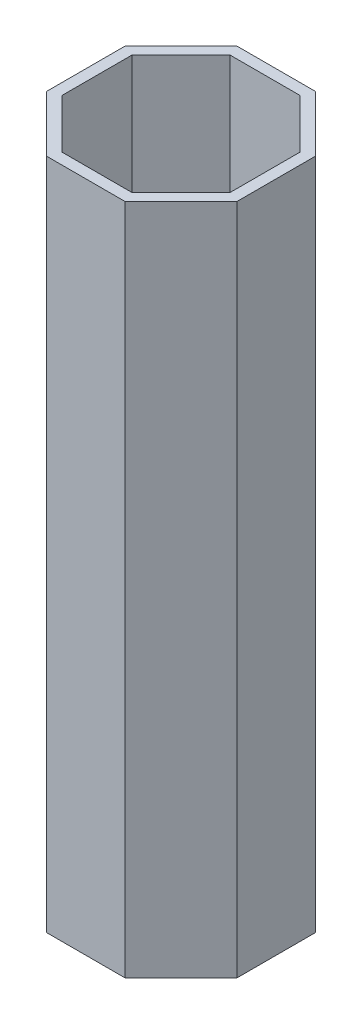
ISO-10303-21;
HEADER;
FILE_DESCRIPTION(('STEP AP214'),'2;1');
FILE_NAME('part.step','',(''),(''),'','','');
FILE_SCHEMA(('AUTOMOTIVE_DESIGN { 1 0 10303 214 1 1 1 1 }'));
ENDSEC;
DATA;
#1=APPLICATION_CONTEXT('core data for automotive mechanical design processes');
#2=APPLICATION_PROTOCOL_DEFINITION('international standard','automotive_design',2000,#1);
#3=PRODUCT_CONTEXT('',#1,'mechanical');
#4=PRODUCT('Part','Part','',(#3));
#5=PRODUCT_RELATED_PRODUCT_CATEGORY('part','',(#4));
#6=PRODUCT_DEFINITION_FORMATION('','',#4);
#7=PRODUCT_DEFINITION_CONTEXT('part definition',#1,'design');
#8=PRODUCT_DEFINITION('design','',#6,#7);
#9=PRODUCT_DEFINITION_SHAPE('','',#8);
#10=(LENGTH_UNIT() NAMED_UNIT(*) SI_UNIT(.MILLI.,.METRE.));
#11=(NAMED_UNIT(*) PLANE_ANGLE_UNIT() SI_UNIT($,.RADIAN.));
#12=(NAMED_UNIT(*) SI_UNIT($,.STERADIAN.) SOLID_ANGLE_UNIT());
#13=UNCERTAINTY_MEASURE_WITH_UNIT(LENGTH_MEASURE(1.E-05),#10,'distance_accuracy_value','');
#14=(GEOMETRIC_REPRESENTATION_CONTEXT(3) GLOBAL_UNCERTAINTY_ASSIGNED_CONTEXT((#13)) GLOBAL_UNIT_ASSIGNED_CONTEXT((#10,
#11,#12)) REPRESENTATION_CONTEXT('',''));
#15=CARTESIAN_POINT('',(0.,0.,0.));
#16=DIRECTION('',(0.,0.,1.));
#17=DIRECTION('',(1.,0.,0.));
#18=AXIS2_PLACEMENT_3D('',#15,#16,#17);
#19=CARTESIAN_POINT('',(0.,120.,-11.));
#20=DIRECTION('',(0.,-1.,0.));
#21=DIRECTION('',(0.,0.,-1.));
#22=AXIS2_PLACEMENT_3D('',#19,#20,#21);
#23=CYLINDRICAL_SURFACE('',#22,1.55);
#24=CARTESIAN_POINT('',(0.,0.,-11.));
#25=DIRECTION('',(0.,1.,0.));
#26=DIRECTION('',(0.,0.,1.));
#27=AXIS2_PLACEMENT_3D('',#24,#25,#26);
#28=CIRCLE('',#27,1.55);
#29=CARTESIAN_POINT('',(0.,0.,-9.45));
#30=VERTEX_POINT('',#29);
#31=EDGE_CURVE('E155',#30,#30,#28,.T.);
#32=ORIENTED_EDGE('',*,*,#31,.F.);
#33=EDGE_LOOP('',(#32));
#34=FACE_BOUND('',#33,.T.);
#35=CARTESIAN_POINT('',(0.,3.,-11.));
#36=DIRECTION('',(0.,1.,0.));
#37=DIRECTION('',(0.,0.,1.));
#38=AXIS2_PLACEMENT_3D('',#35,#36,#37);
#39=CIRCLE('',#38,1.55);
#40=CARTESIAN_POINT('',(0.,3.,-9.45));
#41=VERTEX_POINT('',#40);
#42=EDGE_CURVE('E231',#41,#41,#39,.T.);
#43=ORIENTED_EDGE('',*,*,#42,.T.);
#44=EDGE_LOOP('',(#43));
#45=FACE_BOUND('',#44,.T.);
#46=ADVANCED_FACE('F41',(#34,#45),#23,.F.);
#47=CARTESIAN_POINT('',(0.,120.,0.));
#48=DIRECTION('',(0.,-1.,0.));
#49=DIRECTION('',(0.,0.,-1.));
#50=AXIS2_PLACEMENT_3D('',#47,#48,#49);
#51=CYLINDRICAL_SURFACE('',#50,4.);
#52=CARTESIAN_POINT('',(0.,0.,0.));
#53=DIRECTION('',(0.,1.,0.));
#54=DIRECTION('',(0.,0.,1.));
#55=AXIS2_PLACEMENT_3D('',#52,#53,#54);
#56=CIRCLE('',#55,4.);
#57=CARTESIAN_POINT('',(0.,0.,4.));
#58=VERTEX_POINT('',#57);
#59=EDGE_CURVE('E207',#58,#58,#56,.T.);
#60=ORIENTED_EDGE('',*,*,#59,.F.);
#61=EDGE_LOOP('',(#60));
#62=FACE_BOUND('',#61,.T.);
#63=CARTESIAN_POINT('',(0.,3.,0.));
#64=DIRECTION('',(0.,1.,0.));
#65=DIRECTION('',(0.,0.,1.));
#66=AXIS2_PLACEMENT_3D('',#63,#64,#65);
#67=CIRCLE('',#66,4.);
#68=CARTESIAN_POINT('',(0.,3.,4.));
#69=VERTEX_POINT('',#68);
#70=EDGE_CURVE('E234',#69,#69,#67,.T.);
#71=ORIENTED_EDGE('',*,*,#70,.T.);
#72=EDGE_LOOP('',(#71));
#73=FACE_BOUND('',#72,.T.);
#74=ADVANCED_FACE('F406',(#62,#73),#51,.F.);
#75=CARTESIAN_POINT('',(7.7781745930523,120.,-7.77817459305268));
#76=DIRECTION('',(0.,-1.,0.));
#77=DIRECTION('',(0.,0.,-1.));
#78=AXIS2_PLACEMENT_3D('',#75,#76,#77);
#79=CYLINDRICAL_SURFACE('',#78,1.55000000000008);
#80=CARTESIAN_POINT('',(7.7781745930523,0.,-7.77817459305268));
#81=DIRECTION('',(0.,1.,0.));
#82=DIRECTION('',(0.,0.,1.));
#83=AXIS2_PLACEMENT_3D('',#80,#81,#82);
#84=CIRCLE('',#83,1.55000000000008);
#85=CARTESIAN_POINT('',(7.7781745930523,0.,-6.2281745930526));
#86=VERTEX_POINT('',#85);
#87=EDGE_CURVE('E210',#86,#86,#84,.T.);
#88=ORIENTED_EDGE('',*,*,#87,.F.);
#89=EDGE_LOOP('',(#88));
#90=FACE_BOUND('',#89,.T.);
#91=CARTESIAN_POINT('',(7.7781745930523,3.,-7.77817459305268));
#92=DIRECTION('',(0.,1.,0.));
#93=DIRECTION('',(0.,0.,1.));
#94=AXIS2_PLACEMENT_3D('',#91,#92,#93);
#95=CIRCLE('',#94,1.55000000000008);
#96=CARTESIAN_POINT('',(7.7781745930523,3.,-6.2281745930526));
#97=VERTEX_POINT('',#96);
#98=EDGE_CURVE('E237',#97,#97,#95,.T.);
#99=ORIENTED_EDGE('',*,*,#98,.T.);
#100=EDGE_LOOP('',(#99));
#101=FACE_BOUND('',#100,.T.);
#102=ADVANCED_FACE('F412',(#90,#101),#79,.F.);
#103=CARTESIAN_POINT('',(11.0000000000009,120.,-9.3656929972427E-13));
#104=DIRECTION('',(0.,-1.,0.));
#105=DIRECTION('',(0.,0.,-1.));
#106=AXIS2_PLACEMENT_3D('',#103,#104,#105);
#107=CYLINDRICAL_SURFACE('',#106,1.55000000000066);
#108=CARTESIAN_POINT('',(11.0000000000009,0.,-9.3656929972427E-13));
#109=DIRECTION('',(0.,1.,0.));
#110=DIRECTION('',(0.,0.,1.));
#111=AXIS2_PLACEMENT_3D('',#108,#109,#110);
#112=CIRCLE('',#111,1.55000000000066);
#113=CARTESIAN_POINT('',(11.0000000000009,0.,1.54999999999972));
#114=VERTEX_POINT('',#113);
#115=EDGE_CURVE('E213',#114,#114,#112,.T.);
#116=ORIENTED_EDGE('',*,*,#115,.F.);
#117=EDGE_LOOP('',(#116));
#118=FACE_BOUND('',#117,.T.);
#119=CARTESIAN_POINT('',(11.0000000000009,3.,-9.3656929972427E-13));
#120=DIRECTION('',(0.,1.,0.));
#121=DIRECTION('',(0.,0.,1.));
#122=AXIS2_PLACEMENT_3D('',#119,#120,#121);
#123=CIRCLE('',#122,1.55000000000066);
#124=CARTESIAN_POINT('',(11.0000000000009,3.,1.54999999999972));
#125=VERTEX_POINT('',#124);
#126=EDGE_CURVE('E240',#125,#125,#123,.T.);
#127=ORIENTED_EDGE('',*,*,#126,.T.);
#128=EDGE_LOOP('',(#127));
#129=FACE_BOUND('',#128,.T.);
#130=ADVANCED_FACE('F491',(#118,#129),#107,.F.);
#131=CARTESIAN_POINT('',(7.77817459305362,120.,7.77817459305136));
#132=DIRECTION('',(0.,-1.,0.));
#133=DIRECTION('',(0.,0.,-1.));
#134=AXIS2_PLACEMENT_3D('',#131,#132,#133);
#135=CYLINDRICAL_SURFACE('',#134,1.55000000000139);
#136=CARTESIAN_POINT('',(7.77817459305362,0.,7.77817459305136));
#137=DIRECTION('',(0.,1.,0.));
#138=DIRECTION('',(0.,0.,1.));
#139=AXIS2_PLACEMENT_3D('',#136,#137,#138);
#140=CIRCLE('',#139,1.55000000000139);
#141=CARTESIAN_POINT('',(7.77817459305362,0.,9.32817459305275));
#142=VERTEX_POINT('',#141);
#143=EDGE_CURVE('E216',#142,#142,#140,.T.);
#144=ORIENTED_EDGE('',*,*,#143,.F.);
#145=EDGE_LOOP('',(#144));
#146=FACE_BOUND('',#145,.T.);
#147=CARTESIAN_POINT('',(7.77817459305362,3.,7.77817459305136));
#148=DIRECTION('',(0.,1.,0.));
#149=DIRECTION('',(0.,0.,1.));
#150=AXIS2_PLACEMENT_3D('',#147,#148,#149);
#151=CIRCLE('',#150,1.55000000000139);
#152=CARTESIAN_POINT('',(7.77817459305362,3.,9.32817459305275));
#153=VERTEX_POINT('',#152);
#154=EDGE_CURVE('E243',#153,#153,#151,.T.);
#155=ORIENTED_EDGE('',*,*,#154,.T.);
#156=EDGE_LOOP('',(#155));
#157=FACE_BOUND('',#156,.T.);
#158=ADVANCED_FACE('F483',(#146,#157),#135,.F.);
#159=CARTESIAN_POINT('',(1.87313859944854E-12,120.,11.));
#160=DIRECTION('',(0.,-1.,0.));
#161=DIRECTION('',(0.,0.,-1.));
#162=AXIS2_PLACEMENT_3D('',#159,#160,#161);
#163=CYLINDRICAL_SURFACE('',#162,1.55000000000186);
#164=CARTESIAN_POINT('',(1.87313859944854E-12,0.,11.));
#165=DIRECTION('',(0.,1.,0.));
#166=DIRECTION('',(0.,0.,1.));
#167=AXIS2_PLACEMENT_3D('',#164,#165,#166);
#168=CIRCLE('',#167,1.55000000000186);
#169=CARTESIAN_POINT('',(1.87313859944854E-12,0.,12.5500000000019));
#170=VERTEX_POINT('',#169);
#171=EDGE_CURVE('E219',#170,#170,#168,.T.);
#172=ORIENTED_EDGE('',*,*,#171,.F.);
#173=EDGE_LOOP('',(#172));
#174=FACE_BOUND('',#173,.T.);
#175=CARTESIAN_POINT('',(1.87313859944854E-12,3.,11.));
#176=DIRECTION('',(0.,1.,0.));
#177=DIRECTION('',(0.,0.,1.));
#178=AXIS2_PLACEMENT_3D('',#175,#176,#177);
#179=CIRCLE('',#178,1.55000000000186);
#180=CARTESIAN_POINT('',(1.87313859944854E-12,3.,12.5500000000019));
#181=VERTEX_POINT('',#180);
#182=EDGE_CURVE('E246',#181,#181,#179,.T.);
#183=ORIENTED_EDGE('',*,*,#182,.T.);
#184=EDGE_LOOP('',(#183));
#185=FACE_BOUND('',#184,.T.);
#186=ADVANCED_FACE('F475',(#174,#185),#163,.F.);
#187=CARTESIAN_POINT('',(-7.77817459305042,120.,7.77817459305269));
#188=DIRECTION('',(0.,-1.,0.));
#189=DIRECTION('',(0.,0.,-1.));
#190=AXIS2_PLACEMENT_3D('',#187,#188,#189);
#191=CYLINDRICAL_SURFACE('',#190,1.55000000000181);
#192=CARTESIAN_POINT('',(-7.77817459305042,0.,7.77817459305269));
#193=DIRECTION('',(0.,1.,0.));
#194=DIRECTION('',(0.,0.,1.));
#195=AXIS2_PLACEMENT_3D('',#192,#193,#194);
#196=CIRCLE('',#195,1.55000000000181);
#197=CARTESIAN_POINT('',(-7.77817459305042,0.,9.3281745930545));
#198=VERTEX_POINT('',#197);
#199=EDGE_CURVE('E222',#198,#198,#196,.T.);
#200=ORIENTED_EDGE('',*,*,#199,.F.);
#201=EDGE_LOOP('',(#200));
#202=FACE_BOUND('',#201,.T.);
#203=CARTESIAN_POINT('',(-7.77817459305042,3.,7.77817459305269));
#204=DIRECTION('',(0.,1.,0.));
#205=DIRECTION('',(0.,0.,1.));
#206=AXIS2_PLACEMENT_3D('',#203,#204,#205);
#207=CIRCLE('',#206,1.55000000000181);
#208=CARTESIAN_POINT('',(-7.77817459305042,3.,9.3281745930545));
#209=VERTEX_POINT('',#208);
#210=EDGE_CURVE('E249',#209,#209,#207,.T.);
#211=ORIENTED_EDGE('',*,*,#210,.T.);
#212=EDGE_LOOP('',(#211));
#213=FACE_BOUND('',#212,.T.);
#214=ADVANCED_FACE('F467',(#202,#213),#191,.F.);
#215=CARTESIAN_POINT('',(-10.9999999999991,120.,9.37916411203332E-13));
#216=DIRECTION('',(0.,-1.,0.));
#217=DIRECTION('',(0.,0.,-1.));
#218=AXIS2_PLACEMENT_3D('',#215,#216,#217);
#219=CYLINDRICAL_SURFACE('',#218,1.55000000000128);
#220=CARTESIAN_POINT('',(-10.9999999999991,0.,9.37916411203332E-13));
#221=DIRECTION('',(0.,1.,0.));
#222=DIRECTION('',(0.,0.,1.));
#223=AXIS2_PLACEMENT_3D('',#220,#221,#222);
#224=CIRCLE('',#223,1.55000000000128);
#225=CARTESIAN_POINT('',(-10.9999999999991,0.,1.55000000000222));
#226=VERTEX_POINT('',#225);
#227=EDGE_CURVE('E225',#226,#226,#224,.T.);
#228=ORIENTED_EDGE('',*,*,#227,.F.);
#229=EDGE_LOOP('',(#228));
#230=FACE_BOUND('',#229,.T.);
#231=CARTESIAN_POINT('',(-10.9999999999991,3.,9.37916411203332E-13));
#232=DIRECTION('',(0.,1.,0.));
#233=DIRECTION('',(0.,0.,1.));
#234=AXIS2_PLACEMENT_3D('',#231,#232,#233);
#235=CIRCLE('',#234,1.55000000000128);
#236=CARTESIAN_POINT('',(-10.9999999999991,3.,1.55000000000222));
#237=VERTEX_POINT('',#236);
#238=EDGE_CURVE('E252',#237,#237,#235,.T.);
#239=ORIENTED_EDGE('',*,*,#238,.T.);
#240=EDGE_LOOP('',(#239));
#241=FACE_BOUND('',#240,.T.);
#242=ADVANCED_FACE('F459',(#230,#241),#219,.F.);
#243=CARTESIAN_POINT('',(-7.77817459305175,120.,-7.77817459305136));
#244=DIRECTION('',(0.,-1.,0.));
#245=DIRECTION('',(0.,0.,-1.));
#246=AXIS2_PLACEMENT_3D('',#243,#244,#245);
#247=CYLINDRICAL_SURFACE('',#246,1.55000000000058);
#248=CARTESIAN_POINT('',(-7.77817459305175,0.,-7.77817459305136));
#249=DIRECTION('',(0.,1.,0.));
#250=DIRECTION('',(0.,0.,1.));
#251=AXIS2_PLACEMENT_3D('',#248,#249,#250);
#252=CIRCLE('',#251,1.55000000000058);
#253=CARTESIAN_POINT('',(-7.77817459305175,0.,-6.22817459305077));
#254=VERTEX_POINT('',#253);
#255=EDGE_CURVE('E228',#254,#254,#252,.T.);
#256=ORIENTED_EDGE('',*,*,#255,.F.);
#257=EDGE_LOOP('',(#256));
#258=FACE_BOUND('',#257,.T.);
#259=CARTESIAN_POINT('',(-7.77817459305175,3.,-7.77817459305136));
#260=DIRECTION('',(0.,1.,0.));
#261=DIRECTION('',(0.,0.,1.));
#262=AXIS2_PLACEMENT_3D('',#259,#260,#261);
#263=CIRCLE('',#262,1.55000000000058);
#264=CARTESIAN_POINT('',(-7.77817459305175,3.,-6.22817459305077));
#265=VERTEX_POINT('',#264);
#266=EDGE_CURVE('E45',#265,#265,#263,.T.);
#267=ORIENTED_EDGE('',*,*,#266,.T.);
#268=EDGE_LOOP('',(#267));
#269=FACE_BOUND('',#268,.T.);
#270=ADVANCED_FACE('F421',(#258,#269),#247,.F.);
#271=CARTESIAN_POINT('',(0.,120.,0.));
#272=DIRECTION('',(0.,1.,0.));
#273=DIRECTION('',(0.,0.,1.));
#274=AXIS2_PLACEMENT_3D('',#271,#272,#273);
#275=PLANE('',#274);
#276=DIRECTION('',(-0.707106781186548,0.,-0.707106781186547));
#277=VECTOR('',#276,1.);
#278=CARTESIAN_POINT('',(15.,120.,-6.21320343559643));
#279=LINE('',#278,#277);
#280=CARTESIAN_POINT('',(15.,120.,-6.21320343559643));
#281=VERTEX_POINT('',#280);
#282=CARTESIAN_POINT('',(6.21320343559643,120.,-15.));
#283=VERTEX_POINT('',#282);
#284=EDGE_CURVE('E58',#281,#283,#279,.T.);
#285=ORIENTED_EDGE('',*,*,#284,.F.);
#286=DIRECTION('',(0.,0.,-1.));
#287=VECTOR('',#286,1.);
#288=CARTESIAN_POINT('',(15.,120.,6.21320343559643));
#289=LINE('',#288,#287);
#290=CARTESIAN_POINT('',(15.,120.,6.21320343559643));
#291=VERTEX_POINT('',#290);
#292=EDGE_CURVE('E262',#291,#281,#289,.T.);
#293=ORIENTED_EDGE('',*,*,#292,.F.);
#294=DIRECTION('',(0.707106781186547,0.,-0.707106781186548));
#295=VECTOR('',#294,1.);
#296=CARTESIAN_POINT('',(6.21320343559643,120.,15.));
#297=LINE('',#296,#295);
#298=CARTESIAN_POINT('',(6.21320343559643,120.,15.));
#299=VERTEX_POINT('',#298);
#300=EDGE_CURVE('E288',#299,#291,#297,.T.);
#301=ORIENTED_EDGE('',*,*,#300,.F.);
#302=DIRECTION('',(1.,0.,0.));
#303=VECTOR('',#302,1.);
#304=CARTESIAN_POINT('',(-6.21320343559642,120.,15.));
#305=LINE('',#304,#303);
#306=CARTESIAN_POINT('',(-6.21320343559642,120.,15.));
#307=VERTEX_POINT('',#306);
#308=EDGE_CURVE('E291',#307,#299,#305,.T.);
#309=ORIENTED_EDGE('',*,*,#308,.F.);
#310=DIRECTION('',(0.707106781186548,0.,0.707106781186547));
#311=VECTOR('',#310,1.);
#312=CARTESIAN_POINT('',(-15.,120.,6.21320343559643));
#313=LINE('',#312,#311);
#314=CARTESIAN_POINT('',(-15.,120.,6.21320343559643));
#315=VERTEX_POINT('',#314);
#316=EDGE_CURVE('E294',#315,#307,#313,.T.);
#317=ORIENTED_EDGE('',*,*,#316,.F.);
#318=DIRECTION('',(0.,0.,1.));
#319=VECTOR('',#318,1.);
#320=CARTESIAN_POINT('',(-15.,120.,-6.21320343559643));
#321=LINE('',#320,#319);
#322=CARTESIAN_POINT('',(-15.,120.,-6.21320343559643));
#323=VERTEX_POINT('',#322);
#324=EDGE_CURVE('E297',#323,#315,#321,.T.);
#325=ORIENTED_EDGE('',*,*,#324,.F.);
#326=DIRECTION('',(-0.707106781186547,0.,0.707106781186548));
#327=VECTOR('',#326,1.);
#328=CARTESIAN_POINT('',(-6.21320343559643,120.,-15.));
#329=LINE('',#328,#327);
#330=CARTESIAN_POINT('',(-6.21320343559643,120.,-15.));
#331=VERTEX_POINT('',#330);
#332=EDGE_CURVE('E301',#331,#323,#329,.T.);
#333=ORIENTED_EDGE('',*,*,#332,.F.);
#334=DIRECTION('',(-1.,0.,0.));
#335=VECTOR('',#334,1.);
#336=CARTESIAN_POINT('',(6.21320343559643,120.,-15.));
#337=LINE('',#336,#335);
#338=EDGE_CURVE('E305',#283,#331,#337,.T.);
#339=ORIENTED_EDGE('',*,*,#338,.F.);
#340=EDGE_LOOP('',(#285,#293,#301,#309,#317,#325,#333,#339));
#341=FACE_BOUND('',#340,.T.);
#342=DIRECTION('',(0.707106781186547,0.,-0.707106781186548));
#343=VECTOR('',#342,1.);
#344=CARTESIAN_POINT('',(7.04163056034262,120.,17.));
#345=LINE('',#344,#343);
#346=CARTESIAN_POINT('',(7.04163056034262,120.,17.));
#347=VERTEX_POINT('',#346);
#348=CARTESIAN_POINT('',(17.,120.,7.04163056034261));
#349=VERTEX_POINT('',#348);
#350=EDGE_CURVE('E167',#347,#349,#345,.T.);
#351=ORIENTED_EDGE('',*,*,#350,.T.);
#352=DIRECTION('',(0.,0.,-1.));
#353=VECTOR('',#352,1.);
#354=CARTESIAN_POINT('',(17.,120.,7.04163056034261));
#355=LINE('',#354,#353);
#356=CARTESIAN_POINT('',(17.,120.,-7.04163056034262));
#357=VERTEX_POINT('',#356);
#358=EDGE_CURVE('E108',#349,#357,#355,.T.);
#359=ORIENTED_EDGE('',*,*,#358,.T.);
#360=DIRECTION('',(-0.707106781186548,0.,-0.707106781186547));
#361=VECTOR('',#360,1.);
#362=CARTESIAN_POINT('',(17.,120.,-7.04163056034262));
#363=LINE('',#362,#361);
#364=CARTESIAN_POINT('',(7.0416305603426,120.,-17.));
#365=VERTEX_POINT('',#364);
#366=EDGE_CURVE('E184',#357,#365,#363,.T.);
#367=ORIENTED_EDGE('',*,*,#366,.T.);
#368=DIRECTION('',(-1.,0.,0.));
#369=VECTOR('',#368,1.);
#370=CARTESIAN_POINT('',(7.0416305603426,120.,-17.));
#371=LINE('',#370,#369);
#372=CARTESIAN_POINT('',(-7.04163056034262,120.,-17.));
#373=VERTEX_POINT('',#372);
#374=EDGE_CURVE('E198',#365,#373,#371,.T.);
#375=ORIENTED_EDGE('',*,*,#374,.T.);
#376=DIRECTION('',(-0.707106781186547,0.,0.707106781186548));
#377=VECTOR('',#376,1.);
#378=CARTESIAN_POINT('',(-7.04163056034262,120.,-17.));
#379=LINE('',#378,#377);
#380=CARTESIAN_POINT('',(-17.,120.,-7.04163056034261));
#381=VERTEX_POINT('',#380);
#382=EDGE_CURVE('E130',#373,#381,#379,.T.);
#383=ORIENTED_EDGE('',*,*,#382,.T.);
#384=DIRECTION('',(0.,0.,1.));
#385=VECTOR('',#384,1.);
#386=CARTESIAN_POINT('',(-17.,120.,-7.04163056034261));
#387=LINE('',#386,#385);
#388=CARTESIAN_POINT('',(-17.,120.,7.04163056034262));
#389=VERTEX_POINT('',#388);
#390=EDGE_CURVE('E123',#381,#389,#387,.T.);
#391=ORIENTED_EDGE('',*,*,#390,.T.);
#392=DIRECTION('',(0.707106781186548,0.,0.707106781186547));
#393=VECTOR('',#392,1.);
#394=CARTESIAN_POINT('',(-17.,120.,7.04163056034262));
#395=LINE('',#394,#393);
#396=CARTESIAN_POINT('',(-7.04163056034261,120.,17.));
#397=VERTEX_POINT('',#396);
#398=EDGE_CURVE('E127',#389,#397,#395,.T.);
#399=ORIENTED_EDGE('',*,*,#398,.T.);
#400=DIRECTION('',(1.,0.,0.));
#401=VECTOR('',#400,1.);
#402=CARTESIAN_POINT('',(-7.04163056034261,120.,17.));
#403=LINE('',#402,#401);
#404=EDGE_CURVE('E67',#397,#347,#403,.T.);
#405=ORIENTED_EDGE('',*,*,#404,.T.);
#406=EDGE_LOOP('',(#351,#359,#367,#375,#383,#391,#399,#405));
#407=FACE_BOUND('',#406,.T.);
#408=ADVANCED_FACE('F125',(#341,#407),#275,.T.);
#409=CARTESIAN_POINT('',(0.,0.,0.));
#410=DIRECTION('',(0.,1.,0.));
#411=DIRECTION('',(0.,0.,1.));
#412=AXIS2_PLACEMENT_3D('',#409,#410,#411);
#413=PLANE('',#412);
#414=DIRECTION('',(0.707106781186547,0.,-0.707106781186548));
#415=VECTOR('',#414,1.);
#416=CARTESIAN_POINT('',(7.04163056034262,0.,17.));
#417=LINE('',#416,#415);
#418=CARTESIAN_POINT('',(7.04163056034262,0.,17.));
#419=VERTEX_POINT('',#418);
#420=CARTESIAN_POINT('',(17.,0.,7.04163056034261));
#421=VERTEX_POINT('',#420);
#422=EDGE_CURVE('E151',#419,#421,#417,.T.);
#423=ORIENTED_EDGE('',*,*,#422,.F.);
#424=DIRECTION('',(1.,0.,0.));
#425=VECTOR('',#424,1.);
#426=CARTESIAN_POINT('',(-7.04163056034261,0.,17.));
#427=LINE('',#426,#425);
#428=CARTESIAN_POINT('',(-7.04163056034261,0.,17.));
#429=VERTEX_POINT('',#428);
#430=EDGE_CURVE('E100',#429,#419,#427,.T.);
#431=ORIENTED_EDGE('',*,*,#430,.F.);
#432=DIRECTION('',(0.707106781186548,0.,0.707106781186547));
#433=VECTOR('',#432,1.);
#434=CARTESIAN_POINT('',(-17.,0.,7.04163056034262));
#435=LINE('',#434,#433);
#436=CARTESIAN_POINT('',(-17.,0.,7.04163056034262));
#437=VERTEX_POINT('',#436);
#438=EDGE_CURVE('E164',#437,#429,#435,.T.);
#439=ORIENTED_EDGE('',*,*,#438,.F.);
#440=DIRECTION('',(0.,0.,1.));
#441=VECTOR('',#440,1.);
#442=CARTESIAN_POINT('',(-17.,0.,-7.04163056034261));
#443=LINE('',#442,#441);
#444=CARTESIAN_POINT('',(-17.,0.,-7.04163056034261));
#445=VERTEX_POINT('',#444);
#446=EDGE_CURVE('E139',#445,#437,#443,.T.);
#447=ORIENTED_EDGE('',*,*,#446,.F.);
#448=DIRECTION('',(-0.707106781186547,0.,0.707106781186548));
#449=VECTOR('',#448,1.);
#450=CARTESIAN_POINT('',(-7.04163056034262,0.,-17.));
#451=LINE('',#450,#449);
#452=CARTESIAN_POINT('',(-7.04163056034262,0.,-17.));
#453=VERTEX_POINT('',#452);
#454=EDGE_CURVE('E161',#453,#445,#451,.T.);
#455=ORIENTED_EDGE('',*,*,#454,.F.);
#456=DIRECTION('',(-1.,0.,0.));
#457=VECTOR('',#456,1.);
#458=CARTESIAN_POINT('',(7.0416305603426,0.,-17.));
#459=LINE('',#458,#457);
#460=CARTESIAN_POINT('',(7.0416305603426,0.,-17.));
#461=VERTEX_POINT('',#460);
#462=EDGE_CURVE('E159',#461,#453,#459,.T.);
#463=ORIENTED_EDGE('',*,*,#462,.F.);
#464=DIRECTION('',(-0.707106781186548,0.,-0.707106781186547));
#465=VECTOR('',#464,1.);
#466=CARTESIAN_POINT('',(17.,0.,-7.04163056034262));
#467=LINE('',#466,#465);
#468=CARTESIAN_POINT('',(17.,0.,-7.04163056034262));
#469=VERTEX_POINT('',#468);
#470=EDGE_CURVE('E157',#469,#461,#467,.T.);
#471=ORIENTED_EDGE('',*,*,#470,.F.);
#472=DIRECTION('',(0.,0.,-1.));
#473=VECTOR('',#472,1.);
#474=CARTESIAN_POINT('',(17.,0.,7.04163056034261));
#475=LINE('',#474,#473);
#476=EDGE_CURVE('E154',#421,#469,#475,.T.);
#477=ORIENTED_EDGE('',*,*,#476,.F.);
#478=EDGE_LOOP('',(#423,#431,#439,#447,#455,#463,#471,#477));
#479=FACE_BOUND('',#478,.T.);
#480=ORIENTED_EDGE('',*,*,#31,.T.);
#481=EDGE_LOOP('',(#480));
#482=FACE_BOUND('',#481,.T.);
#483=ORIENTED_EDGE('',*,*,#59,.T.);
#484=EDGE_LOOP('',(#483));
#485=FACE_BOUND('',#484,.T.);
#486=ORIENTED_EDGE('',*,*,#87,.T.);
#487=EDGE_LOOP('',(#486));
#488=FACE_BOUND('',#487,.T.);
#489=ORIENTED_EDGE('',*,*,#115,.T.);
#490=EDGE_LOOP('',(#489));
#491=FACE_BOUND('',#490,.T.);
#492=ORIENTED_EDGE('',*,*,#143,.T.);
#493=EDGE_LOOP('',(#492));
#494=FACE_BOUND('',#493,.T.);
#495=ORIENTED_EDGE('',*,*,#171,.T.);
#496=EDGE_LOOP('',(#495));
#497=FACE_BOUND('',#496,.T.);
#498=ORIENTED_EDGE('',*,*,#199,.T.);
#499=EDGE_LOOP('',(#498));
#500=FACE_BOUND('',#499,.T.);
#501=ORIENTED_EDGE('',*,*,#227,.T.);
#502=EDGE_LOOP('',(#501));
#503=FACE_BOUND('',#502,.T.);
#504=ORIENTED_EDGE('',*,*,#255,.T.);
#505=EDGE_LOOP('',(#504));
#506=FACE_BOUND('',#505,.T.);
#507=ADVANCED_FACE('F188',(#479,#482,#485,#488,#491,#494,#497,#500,#503,#506),#413,.F.);
#508=CARTESIAN_POINT('',(7.04163056034262,120.,17.));
#509=DIRECTION('',(-0.707106781186548,0.,-0.707106781186547));
#510=DIRECTION('',(-0.707106781186547,0.,0.707106781186548));
#511=AXIS2_PLACEMENT_3D('',#508,#509,#510);
#512=PLANE('',#511);
#513=ORIENTED_EDGE('',*,*,#422,.T.);
#514=DIRECTION('',(0.,-1.,0.));
#515=VECTOR('',#514,1.);
#516=CARTESIAN_POINT('',(17.,120.,7.04163056034261));
#517=LINE('',#516,#515);
#518=EDGE_CURVE('E12',#349,#421,#517,.T.);
#519=ORIENTED_EDGE('',*,*,#518,.F.);
#520=ORIENTED_EDGE('',*,*,#350,.F.);
#521=DIRECTION('',(0.,-1.,0.));
#522=VECTOR('',#521,1.);
#523=CARTESIAN_POINT('',(7.04163056034262,120.,17.));
#524=LINE('',#523,#522);
#525=EDGE_CURVE('E147',#347,#419,#524,.T.);
#526=ORIENTED_EDGE('',*,*,#525,.T.);
#527=EDGE_LOOP('',(#513,#519,#520,#526));
#528=FACE_BOUND('',#527,.T.);
#529=ADVANCED_FACE('F43',(#528),#512,.F.);
#530=CARTESIAN_POINT('',(17.,120.,7.04163056034261));
#531=DIRECTION('',(-1.,0.,0.));
#532=DIRECTION('',(0.,0.,1.));
#533=AXIS2_PLACEMENT_3D('',#530,#531,#532);
#534=PLANE('',#533);
#535=ORIENTED_EDGE('',*,*,#476,.T.);
#536=DIRECTION('',(0.,-1.,0.));
#537=VECTOR('',#536,1.);
#538=CARTESIAN_POINT('',(17.,120.,-7.04163056034262));
#539=LINE('',#538,#537);
#540=EDGE_CURVE('E51',#357,#469,#539,.T.);
#541=ORIENTED_EDGE('',*,*,#540,.F.);
#542=ORIENTED_EDGE('',*,*,#358,.F.);
#543=ORIENTED_EDGE('',*,*,#518,.T.);
#544=EDGE_LOOP('',(#535,#541,#542,#543));
#545=FACE_BOUND('',#544,.T.);
#546=ADVANCED_FACE('F435',(#545),#534,.F.);
#547=CARTESIAN_POINT('',(17.,120.,-7.04163056034262));
#548=DIRECTION('',(-0.707106781186547,0.,0.707106781186548));
#549=DIRECTION('',(0.707106781186548,0.,0.707106781186547));
#550=AXIS2_PLACEMENT_3D('',#547,#548,#549);
#551=PLANE('',#550);
#552=ORIENTED_EDGE('',*,*,#470,.T.);
#553=DIRECTION('',(0.,-1.,0.));
#554=VECTOR('',#553,1.);
#555=CARTESIAN_POINT('',(7.0416305603426,120.,-17.));
#556=LINE('',#555,#554);
#557=EDGE_CURVE('E175',#365,#461,#556,.T.);
#558=ORIENTED_EDGE('',*,*,#557,.F.);
#559=ORIENTED_EDGE('',*,*,#366,.F.);
#560=ORIENTED_EDGE('',*,*,#540,.T.);
#561=EDGE_LOOP('',(#552,#558,#559,#560));
#562=FACE_BOUND('',#561,.T.);
#563=ADVANCED_FACE('F182',(#562),#551,.F.);
#564=CARTESIAN_POINT('',(7.0416305603426,120.,-17.));
#565=DIRECTION('',(0.,0.,1.));
#566=DIRECTION('',(1.,0.,0.));
#567=AXIS2_PLACEMENT_3D('',#564,#565,#566);
#568=PLANE('',#567);
#569=ORIENTED_EDGE('',*,*,#462,.T.);
#570=DIRECTION('',(0.,-1.,0.));
#571=VECTOR('',#570,1.);
#572=CARTESIAN_POINT('',(-7.04163056034262,120.,-17.));
#573=LINE('',#572,#571);
#574=EDGE_CURVE('E172',#373,#453,#573,.T.);
#575=ORIENTED_EDGE('',*,*,#574,.F.);
#576=ORIENTED_EDGE('',*,*,#374,.F.);
#577=ORIENTED_EDGE('',*,*,#557,.T.);
#578=EDGE_LOOP('',(#569,#575,#576,#577));
#579=FACE_BOUND('',#578,.T.);
#580=ADVANCED_FACE('F193',(#579),#568,.F.);
#581=CARTESIAN_POINT('',(-7.04163056034262,120.,-17.));
#582=DIRECTION('',(0.707106781186548,0.,0.707106781186547));
#583=DIRECTION('',(0.707106781186547,0.,-0.707106781186548));
#584=AXIS2_PLACEMENT_3D('',#581,#582,#583);
#585=PLANE('',#584);
#586=ORIENTED_EDGE('',*,*,#454,.T.);
#587=DIRECTION('',(0.,-1.,0.));
#588=VECTOR('',#587,1.);
#589=CARTESIAN_POINT('',(-17.,120.,-7.04163056034261));
#590=LINE('',#589,#588);
#591=EDGE_CURVE('E142',#381,#445,#590,.T.);
#592=ORIENTED_EDGE('',*,*,#591,.F.);
#593=ORIENTED_EDGE('',*,*,#382,.F.);
#594=ORIENTED_EDGE('',*,*,#574,.T.);
#595=EDGE_LOOP('',(#586,#592,#593,#594));
#596=FACE_BOUND('',#595,.T.);
#597=ADVANCED_FACE('F196',(#596),#585,.F.);
#598=CARTESIAN_POINT('',(-17.,120.,-7.04163056034261));
#599=DIRECTION('',(1.,0.,0.));
#600=DIRECTION('',(0.,0.,-1.));
#601=AXIS2_PLACEMENT_3D('',#598,#599,#600);
#602=PLANE('',#601);
#603=ORIENTED_EDGE('',*,*,#446,.T.);
#604=DIRECTION('',(0.,-1.,0.));
#605=VECTOR('',#604,1.);
#606=CARTESIAN_POINT('',(-17.,120.,7.04163056034262));
#607=LINE('',#606,#605);
#608=EDGE_CURVE('E136',#389,#437,#607,.T.);
#609=ORIENTED_EDGE('',*,*,#608,.F.);
#610=ORIENTED_EDGE('',*,*,#390,.F.);
#611=ORIENTED_EDGE('',*,*,#591,.T.);
#612=EDGE_LOOP('',(#603,#609,#610,#611));
#613=FACE_BOUND('',#612,.T.);
#614=ADVANCED_FACE('F137',(#613),#602,.F.);
#615=CARTESIAN_POINT('',(-17.,120.,7.04163056034262));
#616=DIRECTION('',(0.707106781186547,0.,-0.707106781186548));
#617=DIRECTION('',(-0.707106781186548,0.,-0.707106781186547));
#618=AXIS2_PLACEMENT_3D('',#615,#616,#617);
#619=PLANE('',#618);
#620=ORIENTED_EDGE('',*,*,#438,.T.);
#621=DIRECTION('',(0.,-1.,0.));
#622=VECTOR('',#621,1.);
#623=CARTESIAN_POINT('',(-7.04163056034261,120.,17.));
#624=LINE('',#623,#622);
#625=EDGE_CURVE('E143',#397,#429,#624,.T.);
#626=ORIENTED_EDGE('',*,*,#625,.F.);
#627=ORIENTED_EDGE('',*,*,#398,.F.);
#628=ORIENTED_EDGE('',*,*,#608,.T.);
#629=EDGE_LOOP('',(#620,#626,#627,#628));
#630=FACE_BOUND('',#629,.T.);
#631=ADVANCED_FACE('F145',(#630),#619,.F.);
#632=CARTESIAN_POINT('',(-7.04163056034261,120.,17.));
#633=DIRECTION('',(0.,0.,-1.));
#634=DIRECTION('',(-1.,0.,0.));
#635=AXIS2_PLACEMENT_3D('',#632,#633,#634);
#636=PLANE('',#635);
#637=ORIENTED_EDGE('',*,*,#430,.T.);
#638=ORIENTED_EDGE('',*,*,#525,.F.);
#639=ORIENTED_EDGE('',*,*,#404,.F.);
#640=ORIENTED_EDGE('',*,*,#625,.T.);
#641=EDGE_LOOP('',(#637,#638,#639,#640));
#642=FACE_BOUND('',#641,.T.);
#643=ADVANCED_FACE('F402',(#642),#636,.F.);
#644=CARTESIAN_POINT('',(15.,-42.4264068711929,-6.21320343559643));
#645=DIRECTION('',(0.707106781186547,0.,-0.707106781186548));
#646=DIRECTION('',(-0.707106781186548,0.,-0.707106781186547));
#647=AXIS2_PLACEMENT_3D('',#644,#645,#646);
#648=PLANE('',#647);
#649=DIRECTION('',(0.707106781186548,0.,0.707106781186547));
#650=VECTOR('',#649,1.);
#651=CARTESIAN_POINT('',(15.,3.,-6.21320343559643));
#652=LINE('',#651,#650);
#653=CARTESIAN_POINT('',(6.21320343559643,3.,-15.));
#654=VERTEX_POINT('',#653);
#655=CARTESIAN_POINT('',(15.,3.,-6.21320343559643));
#656=VERTEX_POINT('',#655);
#657=EDGE_CURVE('E258',#654,#656,#652,.T.);
#658=ORIENTED_EDGE('',*,*,#657,.T.);
#659=DIRECTION('',(0.,1.,0.));
#660=VECTOR('',#659,1.);
#661=CARTESIAN_POINT('',(15.,-42.4264068711929,-6.21320343559643));
#662=LINE('',#661,#660);
#663=EDGE_CURVE('E282',#656,#281,#662,.T.);
#664=ORIENTED_EDGE('',*,*,#663,.T.);
#665=ORIENTED_EDGE('',*,*,#284,.T.);
#666=DIRECTION('',(0.,1.,0.));
#667=VECTOR('',#666,1.);
#668=CARTESIAN_POINT('',(6.21320343559643,-42.4264068711929,-15.));
#669=LINE('',#668,#667);
#670=EDGE_CURVE('E259',#654,#283,#669,.T.);
#671=ORIENTED_EDGE('',*,*,#670,.F.);
#672=EDGE_LOOP('',(#658,#664,#665,#671));
#673=FACE_BOUND('',#672,.T.);
#674=ADVANCED_FACE('F351',(#673),#648,.F.);
#675=CARTESIAN_POINT('',(15.,-42.4264068711929,6.21320343559643));
#676=DIRECTION('',(1.,0.,0.));
#677=DIRECTION('',(0.,0.,-1.));
#678=AXIS2_PLACEMENT_3D('',#675,#676,#677);
#679=PLANE('',#678);
#680=DIRECTION('',(0.,0.,1.));
#681=VECTOR('',#680,1.);
#682=CARTESIAN_POINT('',(15.,3.,6.21320343559643));
#683=LINE('',#682,#681);
#684=CARTESIAN_POINT('',(15.,3.,6.21320343559643));
#685=VERTEX_POINT('',#684);
#686=EDGE_CURVE('E311',#656,#685,#683,.T.);
#687=ORIENTED_EDGE('',*,*,#686,.T.);
#688=DIRECTION('',(0.,1.,0.));
#689=VECTOR('',#688,1.);
#690=CARTESIAN_POINT('',(15.,-42.4264068711929,6.21320343559643));
#691=LINE('',#690,#689);
#692=EDGE_CURVE('E278',#685,#291,#691,.T.);
#693=ORIENTED_EDGE('',*,*,#692,.T.);
#694=ORIENTED_EDGE('',*,*,#292,.T.);
#695=ORIENTED_EDGE('',*,*,#663,.F.);
#696=EDGE_LOOP('',(#687,#693,#694,#695));
#697=FACE_BOUND('',#696,.T.);
#698=ADVANCED_FACE('F394',(#697),#679,.F.);
#699=CARTESIAN_POINT('',(6.21320343559643,-42.4264068711929,15.));
#700=DIRECTION('',(0.707106781186548,0.,0.707106781186547));
#701=DIRECTION('',(0.707106781186547,0.,-0.707106781186548));
#702=AXIS2_PLACEMENT_3D('',#699,#700,#701);
#703=PLANE('',#702);
#704=DIRECTION('',(-0.707106781186547,0.,0.707106781186548));
#705=VECTOR('',#704,1.);
#706=CARTESIAN_POINT('',(6.21320343559643,3.,15.));
#707=LINE('',#706,#705);
#708=CARTESIAN_POINT('',(6.21320343559643,3.,15.));
#709=VERTEX_POINT('',#708);
#710=EDGE_CURVE('E314',#685,#709,#707,.T.);
#711=ORIENTED_EDGE('',*,*,#710,.T.);
#712=DIRECTION('',(0.,1.,0.));
#713=VECTOR('',#712,1.);
#714=CARTESIAN_POINT('',(6.21320343559643,-42.4264068711929,15.));
#715=LINE('',#714,#713);
#716=EDGE_CURVE('E274',#709,#299,#715,.T.);
#717=ORIENTED_EDGE('',*,*,#716,.T.);
#718=ORIENTED_EDGE('',*,*,#300,.T.);
#719=ORIENTED_EDGE('',*,*,#692,.F.);
#720=EDGE_LOOP('',(#711,#717,#718,#719));
#721=FACE_BOUND('',#720,.T.);
#722=ADVANCED_FACE('F391',(#721),#703,.F.);
#723=CARTESIAN_POINT('',(-6.21320343559642,-42.4264068711929,15.));
#724=DIRECTION('',(0.,0.,1.));
#725=DIRECTION('',(1.,0.,0.));
#726=AXIS2_PLACEMENT_3D('',#723,#724,#725);
#727=PLANE('',#726);
#728=DIRECTION('',(-1.,0.,0.));
#729=VECTOR('',#728,1.);
#730=CARTESIAN_POINT('',(-6.21320343559642,3.,15.));
#731=LINE('',#730,#729);
#732=CARTESIAN_POINT('',(-6.21320343559642,3.,15.));
#733=VERTEX_POINT('',#732);
#734=EDGE_CURVE('E317',#709,#733,#731,.T.);
#735=ORIENTED_EDGE('',*,*,#734,.T.);
#736=DIRECTION('',(0.,1.,0.));
#737=VECTOR('',#736,1.);
#738=CARTESIAN_POINT('',(-6.21320343559642,-42.4264068711929,15.));
#739=LINE('',#738,#737);
#740=EDGE_CURVE('E271',#733,#307,#739,.T.);
#741=ORIENTED_EDGE('',*,*,#740,.T.);
#742=ORIENTED_EDGE('',*,*,#308,.T.);
#743=ORIENTED_EDGE('',*,*,#716,.F.);
#744=EDGE_LOOP('',(#735,#741,#742,#743));
#745=FACE_BOUND('',#744,.T.);
#746=ADVANCED_FACE('F388',(#745),#727,.F.);
#747=CARTESIAN_POINT('',(-15.,-42.4264068711929,6.21320343559643));
#748=DIRECTION('',(-0.707106781186547,0.,0.707106781186548));
#749=DIRECTION('',(0.707106781186548,0.,0.707106781186547));
#750=AXIS2_PLACEMENT_3D('',#747,#748,#749);
#751=PLANE('',#750);
#752=DIRECTION('',(-0.707106781186548,0.,-0.707106781186547));
#753=VECTOR('',#752,1.);
#754=CARTESIAN_POINT('',(-15.,3.,6.21320343559643));
#755=LINE('',#754,#753);
#756=CARTESIAN_POINT('',(-15.,3.,6.21320343559643));
#757=VERTEX_POINT('',#756);
#758=EDGE_CURVE('E320',#733,#757,#755,.T.);
#759=ORIENTED_EDGE('',*,*,#758,.T.);
#760=DIRECTION('',(0.,1.,0.));
#761=VECTOR('',#760,1.);
#762=CARTESIAN_POINT('',(-15.,-42.4264068711929,6.21320343559643));
#763=LINE('',#762,#761);
#764=EDGE_CURVE('E268',#757,#315,#763,.T.);
#765=ORIENTED_EDGE('',*,*,#764,.T.);
#766=ORIENTED_EDGE('',*,*,#316,.T.);
#767=ORIENTED_EDGE('',*,*,#740,.F.);
#768=EDGE_LOOP('',(#759,#765,#766,#767));
#769=FACE_BOUND('',#768,.T.);
#770=ADVANCED_FACE('F385',(#769),#751,.F.);
#771=CARTESIAN_POINT('',(-15.,-42.4264068711929,-6.21320343559643));
#772=DIRECTION('',(-1.,0.,0.));
#773=DIRECTION('',(0.,0.,1.));
#774=AXIS2_PLACEMENT_3D('',#771,#772,#773);
#775=PLANE('',#774);
#776=DIRECTION('',(0.,0.,-1.));
#777=VECTOR('',#776,1.);
#778=CARTESIAN_POINT('',(-15.,3.,-6.21320343559643));
#779=LINE('',#778,#777);
#780=CARTESIAN_POINT('',(-15.,3.,-6.21320343559643));
#781=VERTEX_POINT('',#780);
#782=EDGE_CURVE('E323',#757,#781,#779,.T.);
#783=ORIENTED_EDGE('',*,*,#782,.T.);
#784=DIRECTION('',(0.,1.,0.));
#785=VECTOR('',#784,1.);
#786=CARTESIAN_POINT('',(-15.,-42.4264068711929,-6.21320343559643));
#787=LINE('',#786,#785);
#788=EDGE_CURVE('E265',#781,#323,#787,.T.);
#789=ORIENTED_EDGE('',*,*,#788,.T.);
#790=ORIENTED_EDGE('',*,*,#324,.T.);
#791=ORIENTED_EDGE('',*,*,#764,.F.);
#792=EDGE_LOOP('',(#783,#789,#790,#791));
#793=FACE_BOUND('',#792,.T.);
#794=ADVANCED_FACE('F382',(#793),#775,.F.);
#795=CARTESIAN_POINT('',(-6.21320343559643,-42.4264068711929,-15.));
#796=DIRECTION('',(-0.707106781186548,0.,-0.707106781186547));
#797=DIRECTION('',(-0.707106781186547,0.,0.707106781186548));
#798=AXIS2_PLACEMENT_3D('',#795,#796,#797);
#799=PLANE('',#798);
#800=DIRECTION('',(0.707106781186547,0.,-0.707106781186548));
#801=VECTOR('',#800,1.);
#802=CARTESIAN_POINT('',(-6.21320343559643,3.,-15.));
#803=LINE('',#802,#801);
#804=CARTESIAN_POINT('',(-6.21320343559643,3.,-15.));
#805=VERTEX_POINT('',#804);
#806=EDGE_CURVE('E285',#781,#805,#803,.T.);
#807=ORIENTED_EDGE('',*,*,#806,.T.);
#808=DIRECTION('',(0.,1.,0.));
#809=VECTOR('',#808,1.);
#810=CARTESIAN_POINT('',(-6.21320343559643,-42.4264068711929,-15.));
#811=LINE('',#810,#809);
#812=EDGE_CURVE('E261',#805,#331,#811,.T.);
#813=ORIENTED_EDGE('',*,*,#812,.T.);
#814=ORIENTED_EDGE('',*,*,#332,.T.);
#815=ORIENTED_EDGE('',*,*,#788,.F.);
#816=EDGE_LOOP('',(#807,#813,#814,#815));
#817=FACE_BOUND('',#816,.T.);
#818=ADVANCED_FACE('F332',(#817),#799,.F.);
#819=CARTESIAN_POINT('',(6.21320343559643,-42.4264068711929,-15.));
#820=DIRECTION('',(0.,0.,-1.));
#821=DIRECTION('',(-1.,0.,0.));
#822=AXIS2_PLACEMENT_3D('',#819,#820,#821);
#823=PLANE('',#822);
#824=DIRECTION('',(1.,0.,0.));
#825=VECTOR('',#824,1.);
#826=CARTESIAN_POINT('',(6.21320343559643,3.,-15.));
#827=LINE('',#826,#825);
#828=EDGE_CURVE('E255',#805,#654,#827,.T.);
#829=ORIENTED_EDGE('',*,*,#828,.T.);
#830=ORIENTED_EDGE('',*,*,#670,.T.);
#831=ORIENTED_EDGE('',*,*,#338,.T.);
#832=ORIENTED_EDGE('',*,*,#812,.F.);
#833=EDGE_LOOP('',(#829,#830,#831,#832));
#834=FACE_BOUND('',#833,.T.);
#835=ADVANCED_FACE('F341',(#834),#823,.F.);
#836=CARTESIAN_POINT('',(0.,3.,0.));
#837=DIRECTION('',(0.,1.,0.));
#838=DIRECTION('',(0.,0.,1.));
#839=AXIS2_PLACEMENT_3D('',#836,#837,#838);
#840=PLANE('',#839);
#841=ORIENTED_EDGE('',*,*,#42,.F.);
#842=EDGE_LOOP('',(#841));
#843=FACE_BOUND('',#842,.T.);
#844=ORIENTED_EDGE('',*,*,#70,.F.);
#845=EDGE_LOOP('',(#844));
#846=FACE_BOUND('',#845,.T.);
#847=ORIENTED_EDGE('',*,*,#98,.F.);
#848=EDGE_LOOP('',(#847));
#849=FACE_BOUND('',#848,.T.);
#850=ORIENTED_EDGE('',*,*,#126,.F.);
#851=EDGE_LOOP('',(#850));
#852=FACE_BOUND('',#851,.T.);
#853=ORIENTED_EDGE('',*,*,#154,.F.);
#854=EDGE_LOOP('',(#853));
#855=FACE_BOUND('',#854,.T.);
#856=ORIENTED_EDGE('',*,*,#182,.F.);
#857=EDGE_LOOP('',(#856));
#858=FACE_BOUND('',#857,.T.);
#859=ORIENTED_EDGE('',*,*,#210,.F.);
#860=EDGE_LOOP('',(#859));
#861=FACE_BOUND('',#860,.T.);
#862=ORIENTED_EDGE('',*,*,#238,.F.);
#863=EDGE_LOOP('',(#862));
#864=FACE_BOUND('',#863,.T.);
#865=ORIENTED_EDGE('',*,*,#266,.F.);
#866=EDGE_LOOP('',(#865));
#867=FACE_BOUND('',#866,.T.);
#868=ORIENTED_EDGE('',*,*,#657,.F.);
#869=ORIENTED_EDGE('',*,*,#828,.F.);
#870=ORIENTED_EDGE('',*,*,#806,.F.);
#871=ORIENTED_EDGE('',*,*,#782,.F.);
#872=ORIENTED_EDGE('',*,*,#758,.F.);
#873=ORIENTED_EDGE('',*,*,#734,.F.);
#874=ORIENTED_EDGE('',*,*,#710,.F.);
#875=ORIENTED_EDGE('',*,*,#686,.F.);
#876=EDGE_LOOP('',(#868,#869,#870,#871,#872,#873,#874,#875));
#877=FACE_BOUND('',#876,.T.);
#878=ADVANCED_FACE('F345',(#843,#846,#849,#852,#855,#858,#861,#864,#867,#877),#840,.T.);
#879=CLOSED_SHELL('',(#46,#74,#102,#130,#158,#186,#214,#242,#270,#408,#507,#529,#546,#563,#580,
#597,#614,#631,#643,#674,#698,#722,#746,#770,#794,#818,#835,#878));
#880=MANIFOLD_SOLID_BREP('B2',#879);
#881=ADVANCED_BREP_SHAPE_REPRESENTATION('',(#18,#880),#14);
#882=SHAPE_DEFINITION_REPRESENTATION(#9,#881);
ENDSEC;
END-ISO-10303-21;
